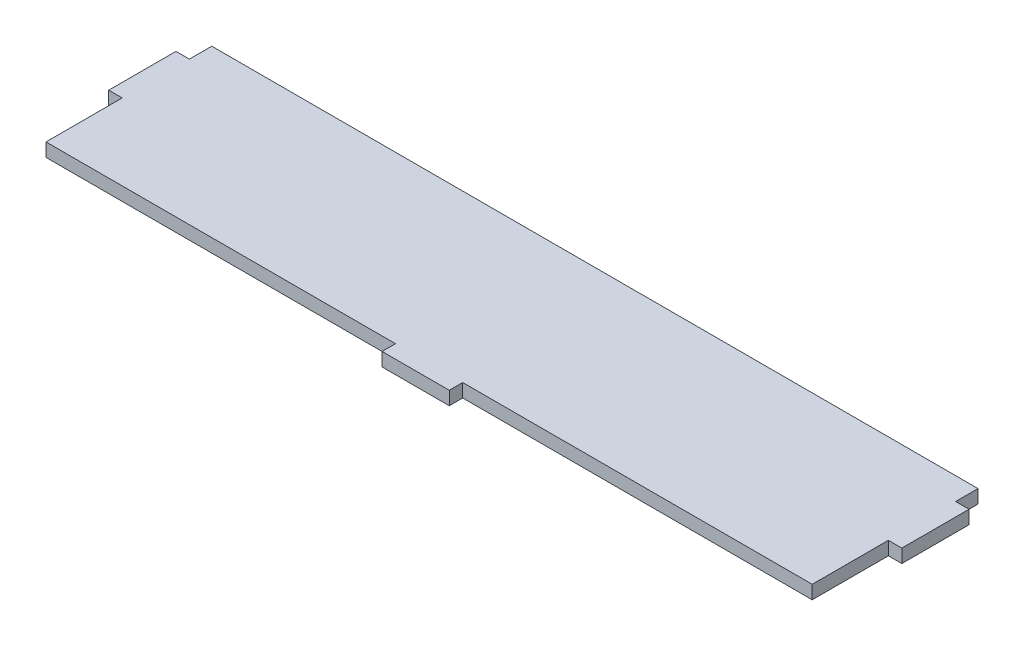
ISO-10303-21;
HEADER;
FILE_DESCRIPTION(('STEP AP214'),'2;1');
FILE_NAME('part.step','',(''),(''),'','','');
FILE_SCHEMA(('AUTOMOTIVE_DESIGN { 1 0 10303 214 1 1 1 1 }'));
ENDSEC;
DATA;
#1=APPLICATION_CONTEXT('core data for automotive mechanical design processes');
#2=APPLICATION_PROTOCOL_DEFINITION('international standard','automotive_design',2000,#1);
#3=PRODUCT_CONTEXT('',#1,'mechanical');
#4=PRODUCT('Part','Part','',(#3));
#5=PRODUCT_RELATED_PRODUCT_CATEGORY('part','',(#4));
#6=PRODUCT_DEFINITION_FORMATION('','',#4);
#7=PRODUCT_DEFINITION_CONTEXT('part definition',#1,'design');
#8=PRODUCT_DEFINITION('design','',#6,#7);
#9=PRODUCT_DEFINITION_SHAPE('','',#8);
#10=(LENGTH_UNIT() NAMED_UNIT(*) SI_UNIT(.MILLI.,.METRE.));
#11=(NAMED_UNIT(*) PLANE_ANGLE_UNIT() SI_UNIT($,.RADIAN.));
#12=(NAMED_UNIT(*) SI_UNIT($,.STERADIAN.) SOLID_ANGLE_UNIT());
#13=UNCERTAINTY_MEASURE_WITH_UNIT(LENGTH_MEASURE(1.E-05),#10,'distance_accuracy_value','');
#14=(GEOMETRIC_REPRESENTATION_CONTEXT(3) GLOBAL_UNCERTAINTY_ASSIGNED_CONTEXT((#13)) GLOBAL_UNIT_ASSIGNED_CONTEXT((#10,
#11,#12)) REPRESENTATION_CONTEXT('',''));
#15=CARTESIAN_POINT('',(0.,0.,0.));
#16=DIRECTION('',(0.,0.,1.));
#17=DIRECTION('',(1.,0.,0.));
#18=AXIS2_PLACEMENT_3D('',#15,#16,#17);
#19=CARTESIAN_POINT('',(0.,3.,0.));
#20=DIRECTION('',(0.,0.,-1.));
#21=DIRECTION('',(-1.,0.,0.));
#22=AXIS2_PLACEMENT_3D('',#19,#20,#21);
#23=PLANE('',#22);
#24=DIRECTION('',(1.,0.,0.));
#25=VECTOR('',#24,1.);
#26=CARTESIAN_POINT('',(0.,0.,0.));
#27=LINE('',#26,#25);
#28=CARTESIAN_POINT('',(-88.5,0.,0.));
#29=VERTEX_POINT('',#28);
#30=CARTESIAN_POINT('',(-85.5,0.,0.));
#31=VERTEX_POINT('',#30);
#32=EDGE_CURVE('E192',#29,#31,#27,.T.);
#33=ORIENTED_EDGE('',*,*,#32,.T.);
#34=DIRECTION('',(0.,-1.,0.));
#35=VECTOR('',#34,1.);
#36=CARTESIAN_POINT('',(-85.5,3.,0.));
#37=LINE('',#36,#35);
#38=CARTESIAN_POINT('',(-85.5,3.,0.));
#39=VERTEX_POINT('',#38);
#40=EDGE_CURVE('E11',#39,#31,#37,.T.);
#41=ORIENTED_EDGE('',*,*,#40,.F.);
#42=DIRECTION('',(1.,0.,0.));
#43=VECTOR('',#42,1.);
#44=CARTESIAN_POINT('',(0.,3.,0.));
#45=LINE('',#44,#43);
#46=CARTESIAN_POINT('',(-88.5,3.,0.));
#47=VERTEX_POINT('',#46);
#48=EDGE_CURVE('E248',#47,#39,#45,.T.);
#49=ORIENTED_EDGE('',*,*,#48,.F.);
#50=DIRECTION('',(0.,-1.,0.));
#51=VECTOR('',#50,1.);
#52=CARTESIAN_POINT('',(-88.5,3.,0.));
#53=LINE('',#52,#51);
#54=EDGE_CURVE('E188',#47,#29,#53,.T.);
#55=ORIENTED_EDGE('',*,*,#54,.T.);
#56=EDGE_LOOP('',(#33,#41,#49,#55));
#57=FACE_BOUND('',#56,.T.);
#58=ADVANCED_FACE('F45',(#57),#23,.F.);
#59=CARTESIAN_POINT('',(-85.5,3.,0.));
#60=DIRECTION('',(1.,0.,0.));
#61=DIRECTION('',(0.,0.,-1.));
#62=AXIS2_PLACEMENT_3D('',#59,#60,#61);
#63=PLANE('',#62);
#64=DIRECTION('',(0.,0.,1.));
#65=VECTOR('',#64,1.);
#66=CARTESIAN_POINT('',(-85.5,0.,0.));
#67=LINE('',#66,#65);
#68=CARTESIAN_POINT('',(-85.5,0.,17.));
#69=VERTEX_POINT('',#68);
#70=EDGE_CURVE('E196',#31,#69,#67,.T.);
#71=ORIENTED_EDGE('',*,*,#70,.T.);
#72=DIRECTION('',(0.,-1.,0.));
#73=VECTOR('',#72,1.);
#74=CARTESIAN_POINT('',(-85.5,3.,17.));
#75=LINE('',#74,#73);
#76=CARTESIAN_POINT('',(-85.5,3.,17.));
#77=VERTEX_POINT('',#76);
#78=EDGE_CURVE('E54',#77,#69,#75,.T.);
#79=ORIENTED_EDGE('',*,*,#78,.F.);
#80=DIRECTION('',(0.,0.,1.));
#81=VECTOR('',#80,1.);
#82=CARTESIAN_POINT('',(-85.5,3.,0.));
#83=LINE('',#82,#81);
#84=EDGE_CURVE('E125',#39,#77,#83,.T.);
#85=ORIENTED_EDGE('',*,*,#84,.F.);
#86=ORIENTED_EDGE('',*,*,#40,.T.);
#87=EDGE_LOOP('',(#71,#79,#85,#86));
#88=FACE_BOUND('',#87,.T.);
#89=ADVANCED_FACE('F294',(#88),#63,.F.);
#90=CARTESIAN_POINT('',(0.,3.,17.));
#91=DIRECTION('',(0.,0.,1.));
#92=DIRECTION('',(1.,0.,0.));
#93=AXIS2_PLACEMENT_3D('',#90,#91,#92);
#94=PLANE('',#93);
#95=DIRECTION('',(-1.,0.,0.));
#96=VECTOR('',#95,1.);
#97=CARTESIAN_POINT('',(0.,0.,17.));
#98=LINE('',#97,#96);
#99=CARTESIAN_POINT('',(-7.49999999999999,0.,17.));
#100=VERTEX_POINT('',#99);
#101=EDGE_CURVE('E200',#100,#69,#98,.T.);
#102=ORIENTED_EDGE('',*,*,#101,.F.);
#103=DIRECTION('',(0.,-1.,0.));
#104=VECTOR('',#103,1.);
#105=CARTESIAN_POINT('',(-7.49999999999999,3.,17.));
#106=LINE('',#105,#104);
#107=CARTESIAN_POINT('',(-7.49999999999999,3.,17.));
#108=VERTEX_POINT('',#107);
#109=EDGE_CURVE('E285',#108,#100,#106,.T.);
#110=ORIENTED_EDGE('',*,*,#109,.F.);
#111=DIRECTION('',(-1.,0.,0.));
#112=VECTOR('',#111,1.);
#113=CARTESIAN_POINT('',(0.,3.,17.));
#114=LINE('',#113,#112);
#115=EDGE_CURVE('E293',#108,#77,#114,.T.);
#116=ORIENTED_EDGE('',*,*,#115,.T.);
#117=ORIENTED_EDGE('',*,*,#78,.T.);
#118=EDGE_LOOP('',(#102,#110,#116,#117));
#119=FACE_BOUND('',#118,.T.);
#120=ADVANCED_FACE('F291',(#119),#94,.T.);
#121=CARTESIAN_POINT('',(-7.49999999999999,3.,0.));
#122=DIRECTION('',(-1.,0.,0.));
#123=DIRECTION('',(0.,0.,1.));
#124=AXIS2_PLACEMENT_3D('',#121,#122,#123);
#125=PLANE('',#124);
#126=DIRECTION('',(0.,0.,-1.));
#127=VECTOR('',#126,1.);
#128=CARTESIAN_POINT('',(-7.49999999999999,0.,0.));
#129=LINE('',#128,#127);
#130=CARTESIAN_POINT('',(-7.49999999999999,0.,20.));
#131=VERTEX_POINT('',#130);
#132=EDGE_CURVE('E204',#131,#100,#129,.T.);
#133=ORIENTED_EDGE('',*,*,#132,.F.);
#134=DIRECTION('',(0.,-1.,0.));
#135=VECTOR('',#134,1.);
#136=CARTESIAN_POINT('',(-7.49999999999999,3.,20.));
#137=LINE('',#136,#135);
#138=CARTESIAN_POINT('',(-7.49999999999999,3.,20.));
#139=VERTEX_POINT('',#138);
#140=EDGE_CURVE('E282',#139,#131,#137,.T.);
#141=ORIENTED_EDGE('',*,*,#140,.F.);
#142=DIRECTION('',(0.,0.,-1.));
#143=VECTOR('',#142,1.);
#144=CARTESIAN_POINT('',(-7.49999999999999,3.,0.));
#145=LINE('',#144,#143);
#146=EDGE_CURVE('E306',#139,#108,#145,.T.);
#147=ORIENTED_EDGE('',*,*,#146,.T.);
#148=ORIENTED_EDGE('',*,*,#109,.T.);
#149=EDGE_LOOP('',(#133,#141,#147,#148));
#150=FACE_BOUND('',#149,.T.);
#151=ADVANCED_FACE('F303',(#150),#125,.T.);
#152=CARTESIAN_POINT('',(0.,3.,20.));
#153=DIRECTION('',(0.,0.,1.));
#154=DIRECTION('',(1.,0.,0.));
#155=AXIS2_PLACEMENT_3D('',#152,#153,#154);
#156=PLANE('',#155);
#157=DIRECTION('',(-1.,0.,0.));
#158=VECTOR('',#157,1.);
#159=CARTESIAN_POINT('',(0.,0.,20.));
#160=LINE('',#159,#158);
#161=CARTESIAN_POINT('',(7.50000000000001,0.,20.));
#162=VERTEX_POINT('',#161);
#163=EDGE_CURVE('E208',#162,#131,#160,.T.);
#164=ORIENTED_EDGE('',*,*,#163,.F.);
#165=DIRECTION('',(0.,-1.,0.));
#166=VECTOR('',#165,1.);
#167=CARTESIAN_POINT('',(7.50000000000001,3.,20.));
#168=LINE('',#167,#166);
#169=CARTESIAN_POINT('',(7.50000000000001,3.,20.));
#170=VERTEX_POINT('',#169);
#171=EDGE_CURVE('E279',#170,#162,#168,.T.);
#172=ORIENTED_EDGE('',*,*,#171,.F.);
#173=DIRECTION('',(-1.,0.,0.));
#174=VECTOR('',#173,1.);
#175=CARTESIAN_POINT('',(0.,3.,20.));
#176=LINE('',#175,#174);
#177=EDGE_CURVE('E313',#170,#139,#176,.T.);
#178=ORIENTED_EDGE('',*,*,#177,.T.);
#179=ORIENTED_EDGE('',*,*,#140,.T.);
#180=EDGE_LOOP('',(#164,#172,#178,#179));
#181=FACE_BOUND('',#180,.T.);
#182=ADVANCED_FACE('F378',(#181),#156,.T.);
#183=CARTESIAN_POINT('',(7.49999999999999,3.,0.));
#184=DIRECTION('',(-1.,0.,0.));
#185=DIRECTION('',(0.,0.,1.));
#186=AXIS2_PLACEMENT_3D('',#183,#184,#185);
#187=PLANE('',#186);
#188=DIRECTION('',(0.,0.,-1.));
#189=VECTOR('',#188,1.);
#190=CARTESIAN_POINT('',(7.49999999999999,0.,0.));
#191=LINE('',#190,#189);
#192=CARTESIAN_POINT('',(7.5,0.,17.));
#193=VERTEX_POINT('',#192);
#194=EDGE_CURVE('E212',#162,#193,#191,.T.);
#195=ORIENTED_EDGE('',*,*,#194,.T.);
#196=DIRECTION('',(0.,-1.,0.));
#197=VECTOR('',#196,1.);
#198=CARTESIAN_POINT('',(7.5,3.,17.));
#199=LINE('',#198,#197);
#200=CARTESIAN_POINT('',(7.5,3.,17.));
#201=VERTEX_POINT('',#200);
#202=EDGE_CURVE('E275',#201,#193,#199,.T.);
#203=ORIENTED_EDGE('',*,*,#202,.F.);
#204=DIRECTION('',(0.,0.,-1.));
#205=VECTOR('',#204,1.);
#206=CARTESIAN_POINT('',(7.49999999999999,3.,0.));
#207=LINE('',#206,#205);
#208=EDGE_CURVE('E320',#170,#201,#207,.T.);
#209=ORIENTED_EDGE('',*,*,#208,.F.);
#210=ORIENTED_EDGE('',*,*,#171,.T.);
#211=EDGE_LOOP('',(#195,#203,#209,#210));
#212=FACE_BOUND('',#211,.T.);
#213=ADVANCED_FACE('F381',(#212),#187,.F.);
#214=CARTESIAN_POINT('',(0.,3.,17.));
#215=DIRECTION('',(0.,0.,-1.));
#216=DIRECTION('',(-1.,0.,0.));
#217=AXIS2_PLACEMENT_3D('',#214,#215,#216);
#218=PLANE('',#217);
#219=DIRECTION('',(1.,0.,0.));
#220=VECTOR('',#219,1.);
#221=CARTESIAN_POINT('',(0.,0.,17.));
#222=LINE('',#221,#220);
#223=CARTESIAN_POINT('',(85.5,0.,17.));
#224=VERTEX_POINT('',#223);
#225=EDGE_CURVE('E215',#193,#224,#222,.T.);
#226=ORIENTED_EDGE('',*,*,#225,.T.);
#227=DIRECTION('',(0.,-1.,0.));
#228=VECTOR('',#227,1.);
#229=CARTESIAN_POINT('',(85.5,3.,17.));
#230=LINE('',#229,#228);
#231=CARTESIAN_POINT('',(85.5,3.,17.));
#232=VERTEX_POINT('',#231);
#233=EDGE_CURVE('E272',#232,#224,#230,.T.);
#234=ORIENTED_EDGE('',*,*,#233,.F.);
#235=DIRECTION('',(1.,0.,0.));
#236=VECTOR('',#235,1.);
#237=CARTESIAN_POINT('',(0.,3.,17.));
#238=LINE('',#237,#236);
#239=EDGE_CURVE('E323',#201,#232,#238,.T.);
#240=ORIENTED_EDGE('',*,*,#239,.F.);
#241=ORIENTED_EDGE('',*,*,#202,.T.);
#242=EDGE_LOOP('',(#226,#234,#240,#241));
#243=FACE_BOUND('',#242,.T.);
#244=ADVANCED_FACE('F385',(#243),#218,.F.);
#245=CARTESIAN_POINT('',(85.5,3.,0.));
#246=DIRECTION('',(1.,0.,0.));
#247=DIRECTION('',(0.,0.,-1.));
#248=AXIS2_PLACEMENT_3D('',#245,#246,#247);
#249=PLANE('',#248);
#250=DIRECTION('',(0.,0.,1.));
#251=VECTOR('',#250,1.);
#252=CARTESIAN_POINT('',(85.5,0.,0.));
#253=LINE('',#252,#251);
#254=CARTESIAN_POINT('',(85.5,0.,0.));
#255=VERTEX_POINT('',#254);
#256=EDGE_CURVE('E219',#255,#224,#253,.T.);
#257=ORIENTED_EDGE('',*,*,#256,.F.);
#258=DIRECTION('',(0.,-1.,0.));
#259=VECTOR('',#258,1.);
#260=CARTESIAN_POINT('',(85.5,3.,0.));
#261=LINE('',#260,#259);
#262=CARTESIAN_POINT('',(85.5,3.,0.));
#263=VERTEX_POINT('',#262);
#264=EDGE_CURVE('E269',#263,#255,#261,.T.);
#265=ORIENTED_EDGE('',*,*,#264,.F.);
#266=DIRECTION('',(0.,0.,1.));
#267=VECTOR('',#266,1.);
#268=CARTESIAN_POINT('',(85.5,3.,0.));
#269=LINE('',#268,#267);
#270=EDGE_CURVE('E326',#263,#232,#269,.T.);
#271=ORIENTED_EDGE('',*,*,#270,.T.);
#272=ORIENTED_EDGE('',*,*,#233,.T.);
#273=EDGE_LOOP('',(#257,#265,#271,#272));
#274=FACE_BOUND('',#273,.T.);
#275=ADVANCED_FACE('F389',(#274),#249,.T.);
#276=CARTESIAN_POINT('',(0.,3.,0.));
#277=DIRECTION('',(0.,0.,1.));
#278=DIRECTION('',(1.,0.,0.));
#279=AXIS2_PLACEMENT_3D('',#276,#277,#278);
#280=PLANE('',#279);
#281=DIRECTION('',(-1.,0.,0.));
#282=VECTOR('',#281,1.);
#283=CARTESIAN_POINT('',(0.,0.,0.));
#284=LINE('',#283,#282);
#285=CARTESIAN_POINT('',(88.5,0.,0.));
#286=VERTEX_POINT('',#285);
#287=EDGE_CURVE('E223',#286,#255,#284,.T.);
#288=ORIENTED_EDGE('',*,*,#287,.F.);
#289=DIRECTION('',(0.,-1.,0.));
#290=VECTOR('',#289,1.);
#291=CARTESIAN_POINT('',(88.5,3.,0.));
#292=LINE('',#291,#290);
#293=CARTESIAN_POINT('',(88.5,3.,0.));
#294=VERTEX_POINT('',#293);
#295=EDGE_CURVE('E266',#294,#286,#292,.T.);
#296=ORIENTED_EDGE('',*,*,#295,.F.);
#297=DIRECTION('',(-1.,0.,0.));
#298=VECTOR('',#297,1.);
#299=CARTESIAN_POINT('',(0.,3.,0.));
#300=LINE('',#299,#298);
#301=EDGE_CURVE('E330',#294,#263,#300,.T.);
#302=ORIENTED_EDGE('',*,*,#301,.T.);
#303=ORIENTED_EDGE('',*,*,#264,.T.);
#304=EDGE_LOOP('',(#288,#296,#302,#303));
#305=FACE_BOUND('',#304,.T.);
#306=ADVANCED_FACE('F393',(#305),#280,.T.);
#307=CARTESIAN_POINT('',(88.5,3.,0.));
#308=DIRECTION('',(1.,0.,0.));
#309=DIRECTION('',(0.,0.,-1.));
#310=AXIS2_PLACEMENT_3D('',#307,#308,#309);
#311=PLANE('',#310);
#312=DIRECTION('',(0.,0.,1.));
#313=VECTOR('',#312,1.);
#314=CARTESIAN_POINT('',(88.5,0.,0.));
#315=LINE('',#314,#313);
#316=CARTESIAN_POINT('',(88.5,0.,-15.));
#317=VERTEX_POINT('',#316);
#318=EDGE_CURVE('E227',#317,#286,#315,.T.);
#319=ORIENTED_EDGE('',*,*,#318,.F.);
#320=DIRECTION('',(0.,-1.,0.));
#321=VECTOR('',#320,1.);
#322=CARTESIAN_POINT('',(88.5,3.,-15.));
#323=LINE('',#322,#321);
#324=CARTESIAN_POINT('',(88.5,3.,-15.));
#325=VERTEX_POINT('',#324);
#326=EDGE_CURVE('E263',#325,#317,#323,.T.);
#327=ORIENTED_EDGE('',*,*,#326,.F.);
#328=DIRECTION('',(0.,0.,1.));
#329=VECTOR('',#328,1.);
#330=CARTESIAN_POINT('',(88.5,3.,0.));
#331=LINE('',#330,#329);
#332=EDGE_CURVE('E334',#325,#294,#331,.T.);
#333=ORIENTED_EDGE('',*,*,#332,.T.);
#334=ORIENTED_EDGE('',*,*,#295,.T.);
#335=EDGE_LOOP('',(#319,#327,#333,#334));
#336=FACE_BOUND('',#335,.T.);
#337=ADVANCED_FACE('F397',(#336),#311,.T.);
#338=CARTESIAN_POINT('',(0.,3.,-15.));
#339=DIRECTION('',(0.,0.,1.));
#340=DIRECTION('',(1.,0.,0.));
#341=AXIS2_PLACEMENT_3D('',#338,#339,#340);
#342=PLANE('',#341);
#343=DIRECTION('',(-1.,0.,0.));
#344=VECTOR('',#343,1.);
#345=CARTESIAN_POINT('',(0.,0.,-15.));
#346=LINE('',#345,#344);
#347=CARTESIAN_POINT('',(85.5,0.,-15.));
#348=VERTEX_POINT('',#347);
#349=EDGE_CURVE('E231',#317,#348,#346,.T.);
#350=ORIENTED_EDGE('',*,*,#349,.T.);
#351=DIRECTION('',(0.,-1.,0.));
#352=VECTOR('',#351,1.);
#353=CARTESIAN_POINT('',(85.5,3.,-15.));
#354=LINE('',#353,#352);
#355=CARTESIAN_POINT('',(85.5,3.,-15.));
#356=VERTEX_POINT('',#355);
#357=EDGE_CURVE('E259',#356,#348,#354,.T.);
#358=ORIENTED_EDGE('',*,*,#357,.F.);
#359=DIRECTION('',(-1.,0.,0.));
#360=VECTOR('',#359,1.);
#361=CARTESIAN_POINT('',(0.,3.,-15.));
#362=LINE('',#361,#360);
#363=EDGE_CURVE('E338',#325,#356,#362,.T.);
#364=ORIENTED_EDGE('',*,*,#363,.F.);
#365=ORIENTED_EDGE('',*,*,#326,.T.);
#366=EDGE_LOOP('',(#350,#358,#364,#365));
#367=FACE_BOUND('',#366,.T.);
#368=ADVANCED_FACE('F401',(#367),#342,.F.);
#369=CARTESIAN_POINT('',(85.5,3.,0.));
#370=DIRECTION('',(-1.,0.,0.));
#371=DIRECTION('',(0.,0.,1.));
#372=AXIS2_PLACEMENT_3D('',#369,#370,#371);
#373=PLANE('',#372);
#374=DIRECTION('',(0.,0.,-1.));
#375=VECTOR('',#374,1.);
#376=CARTESIAN_POINT('',(85.5,0.,0.));
#377=LINE('',#376,#375);
#378=CARTESIAN_POINT('',(85.5,0.,-20.));
#379=VERTEX_POINT('',#378);
#380=EDGE_CURVE('E234',#348,#379,#377,.T.);
#381=ORIENTED_EDGE('',*,*,#380,.T.);
#382=DIRECTION('',(0.,-1.,0.));
#383=VECTOR('',#382,1.);
#384=CARTESIAN_POINT('',(85.5,3.,-20.));
#385=LINE('',#384,#383);
#386=CARTESIAN_POINT('',(85.5,3.,-20.));
#387=VERTEX_POINT('',#386);
#388=EDGE_CURVE('E255',#387,#379,#385,.T.);
#389=ORIENTED_EDGE('',*,*,#388,.F.);
#390=DIRECTION('',(0.,0.,-1.));
#391=VECTOR('',#390,1.);
#392=CARTESIAN_POINT('',(85.5,3.,0.));
#393=LINE('',#392,#391);
#394=EDGE_CURVE('E341',#356,#387,#393,.T.);
#395=ORIENTED_EDGE('',*,*,#394,.F.);
#396=ORIENTED_EDGE('',*,*,#357,.T.);
#397=EDGE_LOOP('',(#381,#389,#395,#396));
#398=FACE_BOUND('',#397,.T.);
#399=ADVANCED_FACE('F350',(#398),#373,.F.);
#400=CARTESIAN_POINT('',(0.,3.,-20.));
#401=DIRECTION('',(0.,0.,1.));
#402=DIRECTION('',(1.,0.,0.));
#403=AXIS2_PLACEMENT_3D('',#400,#401,#402);
#404=PLANE('',#403);
#405=DIRECTION('',(-1.,0.,0.));
#406=VECTOR('',#405,1.);
#407=CARTESIAN_POINT('',(0.,0.,-20.));
#408=LINE('',#407,#406);
#409=CARTESIAN_POINT('',(-85.5,0.,-20.));
#410=VERTEX_POINT('',#409);
#411=EDGE_CURVE('E237',#379,#410,#408,.T.);
#412=ORIENTED_EDGE('',*,*,#411,.T.);
#413=DIRECTION('',(0.,-1.,0.));
#414=VECTOR('',#413,1.);
#415=CARTESIAN_POINT('',(-85.5,3.,-20.));
#416=LINE('',#415,#414);
#417=CARTESIAN_POINT('',(-85.5,3.,-20.));
#418=VERTEX_POINT('',#417);
#419=EDGE_CURVE('E175',#418,#410,#416,.T.);
#420=ORIENTED_EDGE('',*,*,#419,.F.);
#421=DIRECTION('',(-1.,0.,0.));
#422=VECTOR('',#421,1.);
#423=CARTESIAN_POINT('',(0.,3.,-20.));
#424=LINE('',#423,#422);
#425=EDGE_CURVE('E180',#387,#418,#424,.T.);
#426=ORIENTED_EDGE('',*,*,#425,.F.);
#427=ORIENTED_EDGE('',*,*,#388,.T.);
#428=EDGE_LOOP('',(#412,#420,#426,#427));
#429=FACE_BOUND('',#428,.T.);
#430=ADVANCED_FACE('F354',(#429),#404,.F.);
#431=CARTESIAN_POINT('',(-85.5,3.,-2.37310171513626E-13));
#432=DIRECTION('',(-1.,0.,0.));
#433=DIRECTION('',(0.,0.,1.));
#434=AXIS2_PLACEMENT_3D('',#431,#432,#433);
#435=PLANE('',#434);
#436=DIRECTION('',(0.,0.,-1.));
#437=VECTOR('',#436,1.);
#438=CARTESIAN_POINT('',(-85.5,0.,-2.37310171513626E-13));
#439=LINE('',#438,#437);
#440=CARTESIAN_POINT('',(-85.5,0.,-15.));
#441=VERTEX_POINT('',#440);
#442=EDGE_CURVE('E169',#441,#410,#439,.T.);
#443=ORIENTED_EDGE('',*,*,#442,.F.);
#444=DIRECTION('',(0.,-1.,0.));
#445=VECTOR('',#444,1.);
#446=CARTESIAN_POINT('',(-85.5,3.,-15.));
#447=LINE('',#446,#445);
#448=CARTESIAN_POINT('',(-85.5,3.,-15.));
#449=VERTEX_POINT('',#448);
#450=EDGE_CURVE('E164',#449,#441,#447,.T.);
#451=ORIENTED_EDGE('',*,*,#450,.F.);
#452=DIRECTION('',(0.,0.,-1.));
#453=VECTOR('',#452,1.);
#454=CARTESIAN_POINT('',(-85.5,3.,-2.37310171513626E-13));
#455=LINE('',#454,#453);
#456=EDGE_CURVE('E167',#449,#418,#455,.T.);
#457=ORIENTED_EDGE('',*,*,#456,.T.);
#458=ORIENTED_EDGE('',*,*,#419,.T.);
#459=EDGE_LOOP('',(#443,#451,#457,#458));
#460=FACE_BOUND('',#459,.T.);
#461=ADVANCED_FACE('F166',(#460),#435,.T.);
#462=CARTESIAN_POINT('',(0.,3.,-15.));
#463=DIRECTION('',(0.,0.,-1.));
#464=DIRECTION('',(-1.,0.,0.));
#465=AXIS2_PLACEMENT_3D('',#462,#463,#464);
#466=PLANE('',#465);
#467=DIRECTION('',(1.,0.,0.));
#468=VECTOR('',#467,1.);
#469=CARTESIAN_POINT('',(0.,0.,-15.));
#470=LINE('',#469,#468);
#471=CARTESIAN_POINT('',(-88.5,0.,-15.));
#472=VERTEX_POINT('',#471);
#473=EDGE_CURVE('E243',#472,#441,#470,.T.);
#474=ORIENTED_EDGE('',*,*,#473,.F.);
#475=DIRECTION('',(0.,-1.,0.));
#476=VECTOR('',#475,1.);
#477=CARTESIAN_POINT('',(-88.5,3.,-15.));
#478=LINE('',#477,#476);
#479=CARTESIAN_POINT('',(-88.5,3.,-15.));
#480=VERTEX_POINT('',#479);
#481=EDGE_CURVE('E114',#480,#472,#478,.T.);
#482=ORIENTED_EDGE('',*,*,#481,.F.);
#483=DIRECTION('',(1.,0.,0.));
#484=VECTOR('',#483,1.);
#485=CARTESIAN_POINT('',(0.,3.,-15.));
#486=LINE('',#485,#484);
#487=EDGE_CURVE('E178',#480,#449,#486,.T.);
#488=ORIENTED_EDGE('',*,*,#487,.T.);
#489=ORIENTED_EDGE('',*,*,#450,.T.);
#490=EDGE_LOOP('',(#474,#482,#488,#489));
#491=FACE_BOUND('',#490,.T.);
#492=ADVANCED_FACE('F184',(#491),#466,.T.);
#493=CARTESIAN_POINT('',(-88.5,3.,0.));
#494=DIRECTION('',(1.,0.,0.));
#495=DIRECTION('',(0.,0.,-1.));
#496=AXIS2_PLACEMENT_3D('',#493,#494,#495);
#497=PLANE('',#496);
#498=DIRECTION('',(0.,0.,1.));
#499=VECTOR('',#498,1.);
#500=CARTESIAN_POINT('',(-88.5,0.,0.));
#501=LINE('',#500,#499);
#502=EDGE_CURVE('E117',#472,#29,#501,.T.);
#503=ORIENTED_EDGE('',*,*,#502,.T.);
#504=ORIENTED_EDGE('',*,*,#54,.F.);
#505=DIRECTION('',(0.,0.,1.));
#506=VECTOR('',#505,1.);
#507=CARTESIAN_POINT('',(-88.5,3.,0.));
#508=LINE('',#507,#506);
#509=EDGE_CURVE('E62',#480,#47,#508,.T.);
#510=ORIENTED_EDGE('',*,*,#509,.F.);
#511=ORIENTED_EDGE('',*,*,#481,.T.);
#512=EDGE_LOOP('',(#503,#504,#510,#511));
#513=FACE_BOUND('',#512,.T.);
#514=ADVANCED_FACE('F357',(#513),#497,.F.);
#515=CARTESIAN_POINT('',(0.,3.,0.));
#516=DIRECTION('',(0.,1.,0.));
#517=DIRECTION('',(0.,0.,1.));
#518=AXIS2_PLACEMENT_3D('',#515,#516,#517);
#519=PLANE('',#518);
#520=ORIENTED_EDGE('',*,*,#48,.T.);
#521=ORIENTED_EDGE('',*,*,#84,.T.);
#522=ORIENTED_EDGE('',*,*,#115,.F.);
#523=ORIENTED_EDGE('',*,*,#146,.F.);
#524=ORIENTED_EDGE('',*,*,#177,.F.);
#525=ORIENTED_EDGE('',*,*,#208,.T.);
#526=ORIENTED_EDGE('',*,*,#239,.T.);
#527=ORIENTED_EDGE('',*,*,#270,.F.);
#528=ORIENTED_EDGE('',*,*,#301,.F.);
#529=ORIENTED_EDGE('',*,*,#332,.F.);
#530=ORIENTED_EDGE('',*,*,#363,.T.);
#531=ORIENTED_EDGE('',*,*,#394,.T.);
#532=ORIENTED_EDGE('',*,*,#425,.T.);
#533=ORIENTED_EDGE('',*,*,#456,.F.);
#534=ORIENTED_EDGE('',*,*,#487,.F.);
#535=ORIENTED_EDGE('',*,*,#509,.T.);
#536=EDGE_LOOP('',(#520,#521,#522,#523,#524,#525,#526,#527,#528,#529,#530,#531,#532,#533,#534,#535));
#537=FACE_BOUND('',#536,.T.);
#538=ADVANCED_FACE('F177',(#537),#519,.T.);
#539=CARTESIAN_POINT('',(0.,0.,0.));
#540=DIRECTION('',(0.,1.,0.));
#541=DIRECTION('',(0.,0.,1.));
#542=AXIS2_PLACEMENT_3D('',#539,#540,#541);
#543=PLANE('',#542);
#544=ORIENTED_EDGE('',*,*,#32,.F.);
#545=ORIENTED_EDGE('',*,*,#502,.F.);
#546=ORIENTED_EDGE('',*,*,#473,.T.);
#547=ORIENTED_EDGE('',*,*,#442,.T.);
#548=ORIENTED_EDGE('',*,*,#411,.F.);
#549=ORIENTED_EDGE('',*,*,#380,.F.);
#550=ORIENTED_EDGE('',*,*,#349,.F.);
#551=ORIENTED_EDGE('',*,*,#318,.T.);
#552=ORIENTED_EDGE('',*,*,#287,.T.);
#553=ORIENTED_EDGE('',*,*,#256,.T.);
#554=ORIENTED_EDGE('',*,*,#225,.F.);
#555=ORIENTED_EDGE('',*,*,#194,.F.);
#556=ORIENTED_EDGE('',*,*,#163,.T.);
#557=ORIENTED_EDGE('',*,*,#132,.T.);
#558=ORIENTED_EDGE('',*,*,#101,.T.);
#559=ORIENTED_EDGE('',*,*,#70,.F.);
#560=EDGE_LOOP('',(#544,#545,#546,#547,#548,#549,#550,#551,#552,#553,#554,#555,#556,#557,#558,#559));
#561=FACE_BOUND('',#560,.T.);
#562=ADVANCED_FACE('F298',(#561),#543,.F.);
#563=CLOSED_SHELL('',(#58,#89,#120,#151,#182,#213,#244,#275,#306,#337,#368,#399,#430,#461,#492,
#514,#538,#562));
#564=MANIFOLD_SOLID_BREP('B2',#563);
#565=ADVANCED_BREP_SHAPE_REPRESENTATION('',(#18,#564),#14);
#566=SHAPE_DEFINITION_REPRESENTATION(#9,#565);
ENDSEC;
END-ISO-10303-21;
